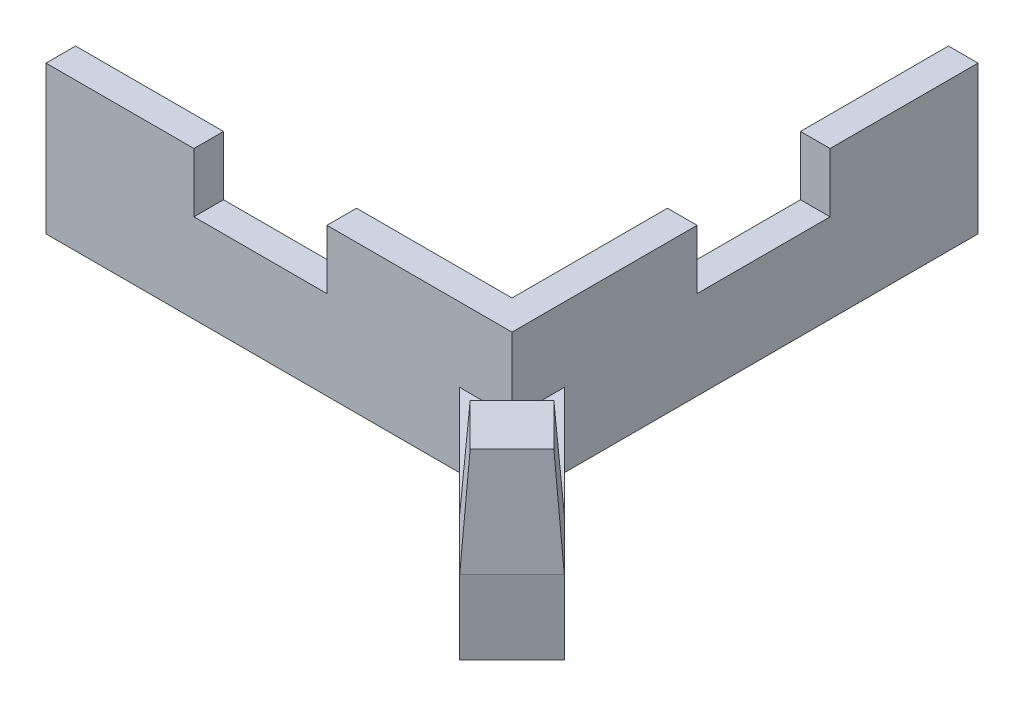
ISO-10303-21;
HEADER;
FILE_DESCRIPTION(('STEP AP214'),'2;1');
FILE_NAME('part.step','',(''),(''),'','','');
FILE_SCHEMA(('AUTOMOTIVE_DESIGN { 1 0 10303 214 1 1 1 1 }'));
ENDSEC;
DATA;
#1=APPLICATION_CONTEXT('core data for automotive mechanical design processes');
#2=APPLICATION_PROTOCOL_DEFINITION('international standard','automotive_design',2000,#1);
#3=PRODUCT_CONTEXT('',#1,'mechanical');
#4=PRODUCT('Part','Part','',(#3));
#5=PRODUCT_RELATED_PRODUCT_CATEGORY('part','',(#4));
#6=PRODUCT_DEFINITION_FORMATION('','',#4);
#7=PRODUCT_DEFINITION_CONTEXT('part definition',#1,'design');
#8=PRODUCT_DEFINITION('design','',#6,#7);
#9=PRODUCT_DEFINITION_SHAPE('','',#8);
#10=(LENGTH_UNIT() NAMED_UNIT(*) SI_UNIT(.MILLI.,.METRE.));
#11=(NAMED_UNIT(*) PLANE_ANGLE_UNIT() SI_UNIT($,.RADIAN.));
#12=(NAMED_UNIT(*) SI_UNIT($,.STERADIAN.) SOLID_ANGLE_UNIT());
#13=UNCERTAINTY_MEASURE_WITH_UNIT(LENGTH_MEASURE(1.E-05),#10,'distance_accuracy_value','');
#14=(GEOMETRIC_REPRESENTATION_CONTEXT(3) GLOBAL_UNCERTAINTY_ASSIGNED_CONTEXT((#13)) GLOBAL_UNIT_ASSIGNED_CONTEXT((#10,
#11,#12)) REPRESENTATION_CONTEXT('',''));
#15=CARTESIAN_POINT('',(0.,0.,0.));
#16=DIRECTION('',(0.,0.,1.));
#17=DIRECTION('',(1.,0.,0.));
#18=AXIS2_PLACEMENT_3D('',#15,#16,#17);
#19=CARTESIAN_POINT('',(-499993.035533906,-15.,-500000.));
#20=DIRECTION('',(0.,1.,0.));
#21=DIRECTION('',(0.,0.,1.));
#22=AXIS2_PLACEMENT_3D('',#19,#20,#21);
#23=PLANE('',#22);
#24=DIRECTION('',(0.707106781186548,0.,0.707106781186548));
#25=VECTOR('',#24,1.);
#26=CARTESIAN_POINT('',(-499993.035533906,-15.,-500000.));
#27=LINE('',#26,#25);
#28=CARTESIAN_POINT('',(8.96446609408486,-15.,2.));
#29=VERTEX_POINT('',#28);
#30=CARTESIAN_POINT('',(16.3890872965288,-15.,9.42462120245594));
#31=VERTEX_POINT('',#30);
#32=EDGE_CURVE('E279',#29,#31,#27,.T.);
#33=ORIENTED_EDGE('',*,*,#32,.T.);
#34=DIRECTION('',(0.707106781186548,0.,-0.707106781186548));
#35=VECTOR('',#34,1.);
#36=CARTESIAN_POINT('',(12.9068542494924,-15.,12.9068542494924));
#37=LINE('',#36,#35);
#38=CARTESIAN_POINT('',(19.9246212025628,-15.,5.88908729662307));
#39=VERTEX_POINT('',#38);
#40=EDGE_CURVE('E289',#31,#39,#37,.T.);
#41=ORIENTED_EDGE('',*,*,#40,.T.);
#42=DIRECTION('',(0.707106781186548,0.,0.707106781186548));
#43=VECTOR('',#42,1.);
#44=CARTESIAN_POINT('',(-499989.5,-15.,-500003.535533906));
#45=LINE('',#44,#43);
#46=CARTESIAN_POINT('',(12.5,-15.,-1.53553390595107));
#47=VERTEX_POINT('',#46);
#48=EDGE_CURVE('E270',#47,#39,#45,.T.);
#49=ORIENTED_EDGE('',*,*,#48,.F.);
#50=DIRECTION('',(0.,0.,-1.));
#51=VECTOR('',#50,1.);
#52=CARTESIAN_POINT('',(12.4999999999886,-15.0000000001227,-500000.));
#53=LINE('',#52,#51);
#54=CARTESIAN_POINT('',(12.4999999999886,-15.,2.00000000000955));
#55=VERTEX_POINT('',#54);
#56=EDGE_CURVE('E288',#55,#47,#53,.T.);
#57=ORIENTED_EDGE('',*,*,#56,.F.);
#58=DIRECTION('',(1.,0.,0.));
#59=VECTOR('',#58,1.);
#60=CARTESIAN_POINT('',(-499993.035533906,-14.9999999998773,2.00000000000955));
#61=LINE('',#60,#59);
#62=EDGE_CURVE('E330',#29,#55,#61,.T.);
#63=ORIENTED_EDGE('',*,*,#62,.F.);
#64=EDGE_LOOP('',(#33,#41,#49,#57,#63));
#65=FACE_BOUND('',#64,.T.);
#66=ADVANCED_FACE('F45',(#65),#23,.T.);
#67=CARTESIAN_POINT('',(0.,-10.,2.));
#68=DIRECTION('',(0.,1.,0.));
#69=DIRECTION('',(0.,0.,1.));
#70=AXIS2_PLACEMENT_3D('',#67,#68,#69);
#71=PLANE('',#70);
#72=DIRECTION('',(0.,0.,1.));
#73=VECTOR('',#72,1.);
#74=CARTESIAN_POINT('',(-9.,-10.,2.));
#75=LINE('',#74,#73);
#76=CARTESIAN_POINT('',(-9.,-10.,0.));
#77=VERTEX_POINT('',#76);
#78=CARTESIAN_POINT('',(-9.,-10.,2.));
#79=VERTEX_POINT('',#78);
#80=EDGE_CURVE('E355',#77,#79,#75,.T.);
#81=ORIENTED_EDGE('',*,*,#80,.F.);
#82=DIRECTION('',(1.,0.,0.));
#83=VECTOR('',#82,1.);
#84=CARTESIAN_POINT('',(0.,-10.,0.));
#85=LINE('',#84,#83);
#86=CARTESIAN_POINT('',(-19.,-10.,0.));
#87=VERTEX_POINT('',#86);
#88=EDGE_CURVE('E432',#87,#77,#85,.T.);
#89=ORIENTED_EDGE('',*,*,#88,.F.);
#90=DIRECTION('',(0.,0.,-1.));
#91=VECTOR('',#90,1.);
#92=CARTESIAN_POINT('',(-19.,-10.,2.));
#93=LINE('',#92,#91);
#94=CARTESIAN_POINT('',(-19.,-10.,2.));
#95=VERTEX_POINT('',#94);
#96=EDGE_CURVE('E366',#95,#87,#93,.T.);
#97=ORIENTED_EDGE('',*,*,#96,.F.);
#98=DIRECTION('',(1.,0.,0.));
#99=VECTOR('',#98,1.);
#100=CARTESIAN_POINT('',(0.,-10.,2.));
#101=LINE('',#100,#99);
#102=EDGE_CURVE('E526',#95,#79,#101,.T.);
#103=ORIENTED_EDGE('',*,*,#102,.T.);
#104=EDGE_LOOP('',(#81,#89,#97,#103));
#105=FACE_BOUND('',#104,.T.);
#106=ADVANCED_FACE('F499',(#105),#71,.T.);
#107=DIRECTION('',(0.,0.,1.));
#108=VECTOR('',#107,1.);
#109=CARTESIAN_POINT('',(10.5,-10.,-20.6980390271856));
#110=LINE('',#109,#108);
#111=CARTESIAN_POINT('',(10.5,-10.,-29.5));
#112=VERTEX_POINT('',#111);
#113=CARTESIAN_POINT('',(10.5,-10.,-19.5));
#114=VERTEX_POINT('',#113);
#115=EDGE_CURVE('E417',#112,#114,#110,.T.);
#116=ORIENTED_EDGE('',*,*,#115,.T.);
#117=DIRECTION('',(1.,0.,0.));
#118=VECTOR('',#117,1.);
#119=CARTESIAN_POINT('',(0.,-10.,-19.5));
#120=LINE('',#119,#118);
#121=CARTESIAN_POINT('',(12.5,-10.,-19.5));
#122=VERTEX_POINT('',#121);
#123=EDGE_CURVE('E383',#114,#122,#120,.T.);
#124=ORIENTED_EDGE('',*,*,#123,.T.);
#125=DIRECTION('',(0.,0.,1.));
#126=VECTOR('',#125,1.);
#127=CARTESIAN_POINT('',(12.5,-10.,0.));
#128=LINE('',#127,#126);
#129=CARTESIAN_POINT('',(12.5,-10.,-29.5));
#130=VERTEX_POINT('',#129);
#131=EDGE_CURVE('E529',#130,#122,#128,.T.);
#132=ORIENTED_EDGE('',*,*,#131,.F.);
#133=DIRECTION('',(1.,0.,0.));
#134=VECTOR('',#133,1.);
#135=CARTESIAN_POINT('',(10.5,-10.,-29.5));
#136=LINE('',#135,#134);
#137=EDGE_CURVE('E390',#112,#130,#136,.T.);
#138=ORIENTED_EDGE('',*,*,#137,.F.);
#139=EDGE_LOOP('',(#116,#124,#132,#138));
#140=FACE_BOUND('',#139,.T.);
#141=ADVANCED_FACE('F449',(#140),#71,.T.);
#142=CARTESIAN_POINT('',(0.,0.,0.));
#143=DIRECTION('',(0.,0.,1.));
#144=DIRECTION('',(1.,0.,0.));
#145=AXIS2_PLACEMENT_3D('',#142,#143,#144);
#146=PLANE('',#145);
#147=ORIENTED_EDGE('',*,*,#88,.T.);
#148=DIRECTION('',(0.,-1.,0.));
#149=VECTOR('',#148,1.);
#150=CARTESIAN_POINT('',(-9.,0.,0.));
#151=LINE('',#150,#149);
#152=CARTESIAN_POINT('',(-9.,-14.,0.));
#153=VERTEX_POINT('',#152);
#154=EDGE_CURVE('E357',#77,#153,#151,.T.);
#155=ORIENTED_EDGE('',*,*,#154,.T.);
#156=DIRECTION('',(1.,0.,0.));
#157=VECTOR('',#156,1.);
#158=CARTESIAN_POINT('',(0.,-14.,0.));
#159=LINE('',#158,#157);
#160=CARTESIAN_POINT('',(-0.0100000000000013,-14.,0.));
#161=VERTEX_POINT('',#160);
#162=EDGE_CURVE('E346',#153,#161,#159,.T.);
#163=ORIENTED_EDGE('',*,*,#162,.T.);
#164=DIRECTION('',(0.,1.,0.));
#165=VECTOR('',#164,1.);
#166=CARTESIAN_POINT('',(-0.0100000000000013,0.,0.));
#167=LINE('',#166,#165);
#168=CARTESIAN_POINT('',(-0.0100000000000013,-10.,0.));
#169=VERTEX_POINT('',#168);
#170=EDGE_CURVE('E352',#161,#169,#167,.T.);
#171=ORIENTED_EDGE('',*,*,#170,.T.);
#172=CARTESIAN_POINT('',(10.5,-10.,0.));
#173=VERTEX_POINT('',#172);
#174=EDGE_CURVE('E430',#169,#173,#85,.T.);
#175=ORIENTED_EDGE('',*,*,#174,.T.);
#176=DIRECTION('',(0.,1.,0.));
#177=VECTOR('',#176,1.);
#178=CARTESIAN_POINT('',(10.5,-10.,0.));
#179=LINE('',#178,#177);
#180=CARTESIAN_POINT('',(10.5,-20.,0.));
#181=VERTEX_POINT('',#180);
#182=EDGE_CURVE('E402',#181,#173,#179,.T.);
#183=ORIENTED_EDGE('',*,*,#182,.F.);
#184=DIRECTION('',(1.,0.,0.));
#185=VECTOR('',#184,1.);
#186=CARTESIAN_POINT('',(0.,-20.,0.));
#187=LINE('',#186,#185);
#188=CARTESIAN_POINT('',(-19.,-20.,0.));
#189=VERTEX_POINT('',#188);
#190=EDGE_CURVE('E443',#189,#181,#187,.T.);
#191=ORIENTED_EDGE('',*,*,#190,.F.);
#192=DIRECTION('',(0.,-1.,0.));
#193=VECTOR('',#192,1.);
#194=CARTESIAN_POINT('',(-19.,-10.,0.));
#195=LINE('',#194,#193);
#196=EDGE_CURVE('E369',#87,#189,#195,.T.);
#197=ORIENTED_EDGE('',*,*,#196,.F.);
#198=EDGE_LOOP('',(#147,#155,#163,#171,#175,#183,#191,#197));
#199=FACE_BOUND('',#198,.T.);
#200=ADVANCED_FACE('F465',(#199),#146,.F.);
#201=DIRECTION('',(0.,0.,-1.));
#202=VECTOR('',#201,1.);
#203=CARTESIAN_POINT('',(-0.0100000000000013,-10.,2.));
#204=LINE('',#203,#202);
#205=CARTESIAN_POINT('',(-0.0100000000000013,-10.,2.));
#206=VERTEX_POINT('',#205);
#207=EDGE_CURVE('E350',#206,#169,#204,.T.);
#208=ORIENTED_EDGE('',*,*,#207,.F.);
#209=CARTESIAN_POINT('',(12.5,-10.,2.));
#210=VERTEX_POINT('',#209);
#211=EDGE_CURVE('E445',#206,#210,#101,.T.);
#212=ORIENTED_EDGE('',*,*,#211,.T.);
#213=CARTESIAN_POINT('',(12.5,-10.,-10.51));
#214=VERTEX_POINT('',#213);
#215=EDGE_CURVE('E473',#214,#210,#128,.T.);
#216=ORIENTED_EDGE('',*,*,#215,.F.);
#217=DIRECTION('',(1.,0.,0.));
#218=VECTOR('',#217,1.);
#219=CARTESIAN_POINT('',(0.,-10.,-10.51));
#220=LINE('',#219,#218);
#221=CARTESIAN_POINT('',(10.5,-10.,-10.51));
#222=VERTEX_POINT('',#221);
#223=EDGE_CURVE('E388',#222,#214,#220,.T.);
#224=ORIENTED_EDGE('',*,*,#223,.F.);
#225=EDGE_CURVE('E411',#222,#173,#110,.T.);
#226=ORIENTED_EDGE('',*,*,#225,.T.);
#227=ORIENTED_EDGE('',*,*,#174,.F.);
#228=EDGE_LOOP('',(#208,#212,#216,#224,#226,#227));
#229=FACE_BOUND('',#228,.T.);
#230=ADVANCED_FACE('F47',(#229),#71,.T.);
#231=CARTESIAN_POINT('',(0.,-20.,2.));
#232=DIRECTION('',(0.,1.,0.));
#233=DIRECTION('',(-1.,0.,0.));
#234=AXIS2_PLACEMENT_3D('',#231,#232,#233);
#235=PLANE('',#234);
#236=ORIENTED_EDGE('',*,*,#190,.T.);
#237=DIRECTION('',(0.,0.,1.));
#238=VECTOR('',#237,1.);
#239=CARTESIAN_POINT('',(10.5,-20.,-20.6980390271856));
#240=LINE('',#239,#238);
#241=CARTESIAN_POINT('',(10.5,-20.,-29.5));
#242=VERTEX_POINT('',#241);
#243=EDGE_CURVE('E414',#242,#181,#240,.T.);
#244=ORIENTED_EDGE('',*,*,#243,.F.);
#245=DIRECTION('',(-1.,0.,0.));
#246=VECTOR('',#245,1.);
#247=CARTESIAN_POINT('',(12.5,-20.,-29.5));
#248=LINE('',#247,#246);
#249=CARTESIAN_POINT('',(12.5,-20.,-29.5));
#250=VERTEX_POINT('',#249);
#251=EDGE_CURVE('E396',#250,#242,#248,.T.);
#252=ORIENTED_EDGE('',*,*,#251,.F.);
#253=DIRECTION('',(0.,0.,-1.));
#254=VECTOR('',#253,1.);
#255=CARTESIAN_POINT('',(12.5,-20.,2.));
#256=LINE('',#255,#254);
#257=CARTESIAN_POINT('',(12.5,-20.,-1.53553390599414));
#258=VERTEX_POINT('',#257);
#259=EDGE_CURVE('E405',#258,#250,#256,.T.);
#260=ORIENTED_EDGE('',*,*,#259,.F.);
#261=DIRECTION('',(0.707106781186548,0.,0.707106781186548));
#262=VECTOR('',#261,1.);
#263=CARTESIAN_POINT('',(-499989.5,-20.,-500003.535533906));
#264=LINE('',#263,#262);
#265=CARTESIAN_POINT('',(23.4601551083915,-20.,9.42462120245875));
#266=VERTEX_POINT('',#265);
#267=EDGE_CURVE('E267',#258,#266,#264,.T.);
#268=ORIENTED_EDGE('',*,*,#267,.T.);
#269=DIRECTION('',(0.707106781186547,0.,-0.707106781186548));
#270=VECTOR('',#269,1.);
#271=CARTESIAN_POINT('',(19.9246212024588,-20.,12.9601551083915));
#272=LINE('',#271,#270);
#273=CARTESIAN_POINT('',(19.9246212024588,-20.,12.9601551083915));
#274=VERTEX_POINT('',#273);
#275=EDGE_CURVE('E255',#274,#266,#272,.T.);
#276=ORIENTED_EDGE('',*,*,#275,.F.);
#277=DIRECTION('',(0.707106781186548,0.,0.707106781186548));
#278=VECTOR('',#277,1.);
#279=CARTESIAN_POINT('',(-499993.035533906,-20.,-500000.));
#280=LINE('',#279,#278);
#281=CARTESIAN_POINT('',(8.96446609408867,-20.,2.));
#282=VERTEX_POINT('',#281);
#283=EDGE_CURVE('E265',#282,#274,#280,.T.);
#284=ORIENTED_EDGE('',*,*,#283,.F.);
#285=DIRECTION('',(1.,0.,0.));
#286=VECTOR('',#285,1.);
#287=CARTESIAN_POINT('',(0.,-20.,2.));
#288=LINE('',#287,#286);
#289=CARTESIAN_POINT('',(-19.,-20.,2.));
#290=VERTEX_POINT('',#289);
#291=EDGE_CURVE('E426',#290,#282,#288,.T.);
#292=ORIENTED_EDGE('',*,*,#291,.F.);
#293=DIRECTION('',(0.,0.,1.));
#294=VECTOR('',#293,1.);
#295=CARTESIAN_POINT('',(-19.,-20.,0.));
#296=LINE('',#295,#294);
#297=EDGE_CURVE('E360',#189,#290,#296,.T.);
#298=ORIENTED_EDGE('',*,*,#297,.F.);
#299=EDGE_LOOP('',(#236,#244,#252,#260,#268,#276,#284,#292,#298));
#300=FACE_BOUND('',#299,.T.);
#301=ADVANCED_FACE('F462',(#300),#235,.F.);
#302=CARTESIAN_POINT('',(0.,0.,2.));
#303=DIRECTION('',(0.,0.,1.));
#304=DIRECTION('',(1.,0.,0.));
#305=AXIS2_PLACEMENT_3D('',#302,#303,#304);
#306=PLANE('',#305);
#307=DIRECTION('',(0.,1.,0.));
#308=VECTOR('',#307,1.);
#309=CARTESIAN_POINT('',(8.96446609408486,-14.9999999997398,2.00000000000955));
#310=LINE('',#309,#308);
#311=EDGE_CURVE('E268',#282,#29,#310,.T.);
#312=ORIENTED_EDGE('',*,*,#311,.T.);
#313=ORIENTED_EDGE('',*,*,#62,.T.);
#314=DIRECTION('',(0.,-1.,0.));
#315=VECTOR('',#314,1.);
#316=CARTESIAN_POINT('',(12.5,-10.,2.));
#317=LINE('',#316,#315);
#318=EDGE_CURVE('E433',#210,#55,#317,.T.);
#319=ORIENTED_EDGE('',*,*,#318,.F.);
#320=ORIENTED_EDGE('',*,*,#211,.F.);
#321=DIRECTION('',(0.,1.,0.));
#322=VECTOR('',#321,1.);
#323=CARTESIAN_POINT('',(-0.0100000000000013,-9.00000000000001,2.));
#324=LINE('',#323,#322);
#325=CARTESIAN_POINT('',(-0.0100000000000013,-14.,2.));
#326=VERTEX_POINT('',#325);
#327=EDGE_CURVE('E333',#326,#206,#324,.T.);
#328=ORIENTED_EDGE('',*,*,#327,.F.);
#329=DIRECTION('',(1.,0.,0.));
#330=VECTOR('',#329,1.);
#331=CARTESIAN_POINT('',(-9.,-14.,2.));
#332=LINE('',#331,#330);
#333=CARTESIAN_POINT('',(-9.,-14.,2.));
#334=VERTEX_POINT('',#333);
#335=EDGE_CURVE('E331',#334,#326,#332,.T.);
#336=ORIENTED_EDGE('',*,*,#335,.F.);
#337=DIRECTION('',(0.,-1.,0.));
#338=VECTOR('',#337,1.);
#339=CARTESIAN_POINT('',(-9.,0.,2.));
#340=LINE('',#339,#338);
#341=EDGE_CURVE('E12',#79,#334,#340,.T.);
#342=ORIENTED_EDGE('',*,*,#341,.F.);
#343=ORIENTED_EDGE('',*,*,#102,.F.);
#344=DIRECTION('',(0.,1.,0.));
#345=VECTOR('',#344,1.);
#346=CARTESIAN_POINT('',(-19.,-20.,2.));
#347=LINE('',#346,#345);
#348=EDGE_CURVE('E363',#290,#95,#347,.T.);
#349=ORIENTED_EDGE('',*,*,#348,.F.);
#350=ORIENTED_EDGE('',*,*,#291,.T.);
#351=EDGE_LOOP('',(#312,#313,#319,#320,#328,#336,#342,#343,#349,#350));
#352=FACE_BOUND('',#351,.T.);
#353=ADVANCED_FACE('F524',(#352),#306,.T.);
#354=CARTESIAN_POINT('',(12.5,0.,0.));
#355=DIRECTION('',(1.,0.,0.));
#356=DIRECTION('',(0.,0.,-1.));
#357=AXIS2_PLACEMENT_3D('',#354,#355,#356);
#358=PLANE('',#357);
#359=DIRECTION('',(0.,-1.,0.));
#360=VECTOR('',#359,1.);
#361=CARTESIAN_POINT('',(12.4999999999886,-15.,-1.53553390595107));
#362=LINE('',#361,#360);
#363=EDGE_CURVE('E325',#47,#258,#362,.T.);
#364=ORIENTED_EDGE('',*,*,#363,.T.);
#365=ORIENTED_EDGE('',*,*,#259,.T.);
#366=DIRECTION('',(0.,-1.,0.));
#367=VECTOR('',#366,1.);
#368=CARTESIAN_POINT('',(12.5,-10.,-29.5));
#369=LINE('',#368,#367);
#370=EDGE_CURVE('E393',#130,#250,#369,.T.);
#371=ORIENTED_EDGE('',*,*,#370,.F.);
#372=ORIENTED_EDGE('',*,*,#131,.T.);
#373=DIRECTION('',(0.,-1.,0.));
#374=VECTOR('',#373,1.);
#375=CARTESIAN_POINT('',(12.5,-9.,-19.5));
#376=LINE('',#375,#374);
#377=CARTESIAN_POINT('',(12.5,-14.,-19.5));
#378=VERTEX_POINT('',#377);
#379=EDGE_CURVE('E377',#122,#378,#376,.T.);
#380=ORIENTED_EDGE('',*,*,#379,.T.);
#381=DIRECTION('',(0.,0.,-1.));
#382=VECTOR('',#381,1.);
#383=CARTESIAN_POINT('',(12.5,-14.,-10.51));
#384=LINE('',#383,#382);
#385=CARTESIAN_POINT('',(12.5,-14.,-10.51));
#386=VERTEX_POINT('',#385);
#387=EDGE_CURVE('E374',#386,#378,#384,.T.);
#388=ORIENTED_EDGE('',*,*,#387,.F.);
#389=DIRECTION('',(0.,-1.,0.));
#390=VECTOR('',#389,1.);
#391=CARTESIAN_POINT('',(12.5,-9.,-10.51));
#392=LINE('',#391,#390);
#393=EDGE_CURVE('E372',#214,#386,#392,.T.);
#394=ORIENTED_EDGE('',*,*,#393,.F.);
#395=ORIENTED_EDGE('',*,*,#215,.T.);
#396=ORIENTED_EDGE('',*,*,#318,.T.);
#397=ORIENTED_EDGE('',*,*,#56,.T.);
#398=EDGE_LOOP('',(#364,#365,#371,#372,#380,#388,#394,#395,#396,#397));
#399=FACE_BOUND('',#398,.T.);
#400=ADVANCED_FACE('F480',(#399),#358,.T.);
#401=CARTESIAN_POINT('',(10.5,-10.,-20.6980390271856));
#402=DIRECTION('',(1.,0.,0.));
#403=DIRECTION('',(0.,1.,0.));
#404=AXIS2_PLACEMENT_3D('',#401,#402,#403);
#405=PLANE('',#404);
#406=ORIENTED_EDGE('',*,*,#225,.F.);
#407=DIRECTION('',(0.,-1.,0.));
#408=VECTOR('',#407,1.);
#409=CARTESIAN_POINT('',(10.5,-10.,-10.51));
#410=LINE('',#409,#408);
#411=CARTESIAN_POINT('',(10.5,-14.,-10.51));
#412=VERTEX_POINT('',#411);
#413=EDGE_CURVE('E55',#222,#412,#410,.T.);
#414=ORIENTED_EDGE('',*,*,#413,.T.);
#415=DIRECTION('',(0.,0.,-1.));
#416=VECTOR('',#415,1.);
#417=CARTESIAN_POINT('',(10.5,-14.,-20.6980390271856));
#418=LINE('',#417,#416);
#419=CARTESIAN_POINT('',(10.5,-14.,-19.5));
#420=VERTEX_POINT('',#419);
#421=EDGE_CURVE('E422',#412,#420,#418,.T.);
#422=ORIENTED_EDGE('',*,*,#421,.T.);
#423=DIRECTION('',(0.,-1.,0.));
#424=VECTOR('',#423,1.);
#425=CARTESIAN_POINT('',(10.5,-10.,-19.5));
#426=LINE('',#425,#424);
#427=EDGE_CURVE('E425',#114,#420,#426,.T.);
#428=ORIENTED_EDGE('',*,*,#427,.F.);
#429=ORIENTED_EDGE('',*,*,#115,.F.);
#430=DIRECTION('',(0.,1.,0.));
#431=VECTOR('',#430,1.);
#432=CARTESIAN_POINT('',(10.5,-20.,-29.5));
#433=LINE('',#432,#431);
#434=EDGE_CURVE('E399',#242,#112,#433,.T.);
#435=ORIENTED_EDGE('',*,*,#434,.F.);
#436=ORIENTED_EDGE('',*,*,#243,.T.);
#437=ORIENTED_EDGE('',*,*,#182,.T.);
#438=EDGE_LOOP('',(#406,#414,#422,#428,#429,#435,#436,#437));
#439=FACE_BOUND('',#438,.T.);
#440=ADVANCED_FACE('F455',(#439),#405,.F.);
#441=CARTESIAN_POINT('',(0.,0.,-29.5));
#442=DIRECTION('',(0.,0.,-1.));
#443=DIRECTION('',(-1.,0.,0.));
#444=AXIS2_PLACEMENT_3D('',#441,#442,#443);
#445=PLANE('',#444);
#446=ORIENTED_EDGE('',*,*,#137,.T.);
#447=ORIENTED_EDGE('',*,*,#370,.T.);
#448=ORIENTED_EDGE('',*,*,#251,.T.);
#449=ORIENTED_EDGE('',*,*,#434,.T.);
#450=EDGE_LOOP('',(#446,#447,#448,#449));
#451=FACE_BOUND('',#450,.T.);
#452=ADVANCED_FACE('F457',(#451),#445,.T.);
#453=CARTESIAN_POINT('',(-6.5,-14.,-10.51));
#454=DIRECTION('',(0.,-1.,0.));
#455=DIRECTION('',(0.,0.,-1.));
#456=AXIS2_PLACEMENT_3D('',#453,#454,#455);
#457=PLANE('',#456);
#458=DIRECTION('',(1.,0.,0.));
#459=VECTOR('',#458,1.);
#460=CARTESIAN_POINT('',(-6.5,-14.,-10.51));
#461=LINE('',#460,#459);
#462=EDGE_CURVE('E380',#412,#386,#461,.T.);
#463=ORIENTED_EDGE('',*,*,#462,.T.);
#464=ORIENTED_EDGE('',*,*,#387,.T.);
#465=DIRECTION('',(1.,0.,0.));
#466=VECTOR('',#465,1.);
#467=CARTESIAN_POINT('',(-6.5,-14.,-19.5));
#468=LINE('',#467,#466);
#469=EDGE_CURVE('E381',#420,#378,#468,.T.);
#470=ORIENTED_EDGE('',*,*,#469,.F.);
#471=ORIENTED_EDGE('',*,*,#421,.F.);
#472=EDGE_LOOP('',(#463,#464,#470,#471));
#473=FACE_BOUND('',#472,.T.);
#474=ADVANCED_FACE('F483',(#473),#457,.F.);
#475=CARTESIAN_POINT('',(-6.5,-9.,-10.51));
#476=DIRECTION('',(0.,0.,1.));
#477=DIRECTION('',(1.,0.,0.));
#478=AXIS2_PLACEMENT_3D('',#475,#476,#477);
#479=PLANE('',#478);
#480=ORIENTED_EDGE('',*,*,#223,.T.);
#481=ORIENTED_EDGE('',*,*,#393,.T.);
#482=ORIENTED_EDGE('',*,*,#462,.F.);
#483=ORIENTED_EDGE('',*,*,#413,.F.);
#484=EDGE_LOOP('',(#480,#481,#482,#483));
#485=FACE_BOUND('',#484,.T.);
#486=ADVANCED_FACE('F476',(#485),#479,.F.);
#487=CARTESIAN_POINT('',(-6.5,-9.,-19.5));
#488=DIRECTION('',(0.,0.,1.));
#489=DIRECTION('',(1.,0.,0.));
#490=AXIS2_PLACEMENT_3D('',#487,#488,#489);
#491=PLANE('',#490);
#492=ORIENTED_EDGE('',*,*,#427,.T.);
#493=ORIENTED_EDGE('',*,*,#469,.T.);
#494=ORIENTED_EDGE('',*,*,#379,.F.);
#495=ORIENTED_EDGE('',*,*,#123,.F.);
#496=EDGE_LOOP('',(#492,#493,#494,#495));
#497=FACE_BOUND('',#496,.T.);
#498=ADVANCED_FACE('F485',(#497),#491,.T.);
#499=CARTESIAN_POINT('',(-19.,0.,0.));
#500=DIRECTION('',(-1.,0.,0.));
#501=DIRECTION('',(0.,-1.,0.));
#502=AXIS2_PLACEMENT_3D('',#499,#500,#501);
#503=PLANE('',#502);
#504=ORIENTED_EDGE('',*,*,#297,.T.);
#505=ORIENTED_EDGE('',*,*,#348,.T.);
#506=ORIENTED_EDGE('',*,*,#96,.T.);
#507=ORIENTED_EDGE('',*,*,#196,.T.);
#508=EDGE_LOOP('',(#504,#505,#506,#507));
#509=FACE_BOUND('',#508,.T.);
#510=ADVANCED_FACE('F487',(#509),#503,.T.);
#511=CARTESIAN_POINT('',(-9.,-9.00000000000001,-17.));
#512=DIRECTION('',(-1.,0.,0.));
#513=DIRECTION('',(0.,0.,1.));
#514=AXIS2_PLACEMENT_3D('',#511,#512,#513);
#515=PLANE('',#514);
#516=ORIENTED_EDGE('',*,*,#80,.T.);
#517=ORIENTED_EDGE('',*,*,#341,.T.);
#518=DIRECTION('',(0.,0.,1.));
#519=VECTOR('',#518,1.);
#520=CARTESIAN_POINT('',(-9.,-14.,-17.));
#521=LINE('',#520,#519);
#522=EDGE_CURVE('E339',#153,#334,#521,.T.);
#523=ORIENTED_EDGE('',*,*,#522,.F.);
#524=ORIENTED_EDGE('',*,*,#154,.F.);
#525=EDGE_LOOP('',(#516,#517,#523,#524));
#526=FACE_BOUND('',#525,.T.);
#527=ADVANCED_FACE('F493',(#526),#515,.F.);
#528=CARTESIAN_POINT('',(-0.0100000000000013,-9.00000000000001,-17.));
#529=DIRECTION('',(1.,0.,0.));
#530=DIRECTION('',(0.,0.,-1.));
#531=AXIS2_PLACEMENT_3D('',#528,#529,#530);
#532=PLANE('',#531);
#533=DIRECTION('',(0.,0.,1.));
#534=VECTOR('',#533,1.);
#535=CARTESIAN_POINT('',(-0.0100000000000013,-14.,-17.));
#536=LINE('',#535,#534);
#537=EDGE_CURVE('E344',#161,#326,#536,.T.);
#538=ORIENTED_EDGE('',*,*,#537,.T.);
#539=ORIENTED_EDGE('',*,*,#327,.T.);
#540=ORIENTED_EDGE('',*,*,#207,.T.);
#541=ORIENTED_EDGE('',*,*,#170,.F.);
#542=EDGE_LOOP('',(#538,#539,#540,#541));
#543=FACE_BOUND('',#542,.T.);
#544=ADVANCED_FACE('F508',(#543),#532,.F.);
#545=CARTESIAN_POINT('',(-9.,-14.,-17.));
#546=DIRECTION('',(0.,-1.,0.));
#547=DIRECTION('',(0.,0.,-1.));
#548=AXIS2_PLACEMENT_3D('',#545,#546,#547);
#549=PLANE('',#548);
#550=ORIENTED_EDGE('',*,*,#522,.T.);
#551=ORIENTED_EDGE('',*,*,#335,.T.);
#552=ORIENTED_EDGE('',*,*,#537,.F.);
#553=ORIENTED_EDGE('',*,*,#162,.F.);
#554=EDGE_LOOP('',(#550,#551,#552,#553));
#555=FACE_BOUND('',#554,.T.);
#556=ADVANCED_FACE('F511',(#555),#549,.F.);
#557=CARTESIAN_POINT('',(-499989.5,-15.,-500003.535533906));
#558=DIRECTION('',(0.707106781186548,0.,-0.707106781186548));
#559=DIRECTION('',(-0.707106781186548,0.,-0.707106781186548));
#560=AXIS2_PLACEMENT_3D('',#557,#558,#559);
#561=PLANE('',#560);
#562=ORIENTED_EDGE('',*,*,#363,.F.);
#563=ORIENTED_EDGE('',*,*,#48,.T.);
#564=DIRECTION('',(-0.707106781186548,0.,-0.707106781186548));
#565=VECTOR('',#564,1.);
#566=CARTESIAN_POINT('',(7.01776695300616,-15.,-7.01776695300616));
#567=LINE('',#566,#565);
#568=CARTESIAN_POINT('',(23.4601551084574,-14.9999999993471,9.424621202498));
#569=VERTEX_POINT('',#568);
#570=EDGE_CURVE('E63',#569,#39,#567,.T.);
#571=ORIENTED_EDGE('',*,*,#570,.F.);
#572=DIRECTION('',(0.,1.,0.));
#573=VECTOR('',#572,1.);
#574=CARTESIAN_POINT('',(23.4601551083915,-20.,9.42462120245875));
#575=LINE('',#574,#573);
#576=EDGE_CURVE('E263',#266,#569,#575,.T.);
#577=ORIENTED_EDGE('',*,*,#576,.F.);
#578=ORIENTED_EDGE('',*,*,#267,.F.);
#579=EDGE_LOOP('',(#562,#563,#571,#577,#578));
#580=FACE_BOUND('',#579,.T.);
#581=ADVANCED_FACE('F323',(#580),#561,.T.);
#582=CARTESIAN_POINT('',(-499993.035533906,-15.,-500000.));
#583=DIRECTION('',(-0.707106781186548,0.,0.707106781186548));
#584=DIRECTION('',(0.707106781186548,0.,0.707106781186548));
#585=AXIS2_PLACEMENT_3D('',#582,#583,#584);
#586=PLANE('',#585);
#587=ORIENTED_EDGE('',*,*,#311,.F.);
#588=ORIENTED_EDGE('',*,*,#283,.T.);
#589=DIRECTION('',(0.,-1.,0.));
#590=VECTOR('',#589,1.);
#591=CARTESIAN_POINT('',(19.9246212024588,-15.,12.9601551083915));
#592=LINE('',#591,#590);
#593=CARTESIAN_POINT('',(19.9246212024588,-15.,12.9601551083915));
#594=VERTEX_POINT('',#593);
#595=EDGE_CURVE('E264',#594,#274,#592,.T.);
#596=ORIENTED_EDGE('',*,*,#595,.F.);
#597=DIRECTION('',(0.707106781186548,0.,0.707106781186548));
#598=VECTOR('',#597,1.);
#599=CARTESIAN_POINT('',(3.48223304703644,-15.,-3.48223304703644));
#600=LINE('',#599,#598);
#601=EDGE_CURVE('E291',#31,#594,#600,.T.);
#602=ORIENTED_EDGE('',*,*,#601,.F.);
#603=ORIENTED_EDGE('',*,*,#32,.F.);
#604=EDGE_LOOP('',(#587,#588,#596,#602,#603));
#605=FACE_BOUND('',#604,.T.);
#606=ADVANCED_FACE('F315',(#605),#586,.T.);
#607=CARTESIAN_POINT('',(16.4423881554251,0.,16.4423881554251));
#608=DIRECTION('',(0.707106781186548,0.,0.707106781186547));
#609=DIRECTION('',(0.707106781186547,0.,-0.707106781186548));
#610=AXIS2_PLACEMENT_3D('',#607,#608,#609);
#611=PLANE('',#610);
#612=DIRECTION('',(0.707106781186547,0.,-0.707106781186548));
#613=VECTOR('',#612,1.);
#614=CARTESIAN_POINT('',(16.4423881554251,-15.,16.4423881554251));
#615=LINE('',#614,#613);
#616=EDGE_CURVE('E283',#569,#594,#615,.F.);
#617=ORIENTED_EDGE('',*,*,#616,.T.);
#618=ORIENTED_EDGE('',*,*,#595,.T.);
#619=ORIENTED_EDGE('',*,*,#275,.T.);
#620=ORIENTED_EDGE('',*,*,#576,.T.);
#621=EDGE_LOOP('',(#617,#618,#619,#620));
#622=FACE_BOUND('',#621,.T.);
#623=ADVANCED_FACE('F229',(#622),#611,.T.);
#624=CARTESIAN_POINT('',(0.,-8.,0.));
#625=DIRECTION('',(0.,1.,0.));
#626=DIRECTION('',(0.,0.,1.));
#627=AXIS2_PLACEMENT_3D('',#624,#625,#626);
#628=PLANE('',#627);
#629=DIRECTION('',(-0.707106781186548,0.,-0.707106781186547));
#630=VECTOR('',#629,1.);
#631=CARTESIAN_POINT('',(3.8357864376357,-8.,-3.8357864376357));
#632=LINE('',#631,#630);
#633=CARTESIAN_POINT('',(19.9246212024675,-8.,12.2530483271961));
#634=VERTEX_POINT('',#633);
#635=CARTESIAN_POINT('',(17.0961940777214,-8.,9.42462120244995));
#636=VERTEX_POINT('',#635);
#637=EDGE_CURVE('E250',#634,#636,#632,.T.);
#638=ORIENTED_EDGE('',*,*,#637,.F.);
#639=DIRECTION('',(0.707106781186547,0.,-0.707106781186548));
#640=VECTOR('',#639,1.);
#641=CARTESIAN_POINT('',(16.0888347648319,-8.,16.0888347648318));
#642=LINE('',#641,#640);
#643=CARTESIAN_POINT('',(22.7530483272137,-8.00000000000001,9.42462120244995));
#644=VERTEX_POINT('',#643);
#645=EDGE_CURVE('E210',#634,#644,#642,.T.);
#646=ORIENTED_EDGE('',*,*,#645,.T.);
#647=DIRECTION('',(-0.707106781186547,0.,-0.707106781186548));
#648=VECTOR('',#647,1.);
#649=CARTESIAN_POINT('',(6.6642135623819,-8.00000000000001,-6.6642135623819));
#650=LINE('',#649,#648);
#651=CARTESIAN_POINT('',(19.9246212024676,-8.00000000000001,6.59619407770376));
#652=VERTEX_POINT('',#651);
#653=EDGE_CURVE('E187',#644,#652,#650,.T.);
#654=ORIENTED_EDGE('',*,*,#653,.T.);
#655=DIRECTION('',(-0.707106781186548,0.,0.707106781186547));
#656=VECTOR('',#655,1.);
#657=CARTESIAN_POINT('',(13.2604076400856,-8.,13.2604076400857));
#658=LINE('',#657,#656);
#659=EDGE_CURVE('E196',#652,#636,#658,.T.);
#660=ORIENTED_EDGE('',*,*,#659,.T.);
#661=EDGE_LOOP('',(#638,#646,#654,#660));
#662=FACE_BOUND('',#661,.T.);
#663=ADVANCED_FACE('F209',(#662),#628,.T.);
#664=CARTESIAN_POINT('',(6.22837512043616,0.62916089768858,-6.22837512043616));
#665=DIRECTION('',(0.705309810603516,0.0712470499941236,-0.705309810603516));
#666=DIRECTION('',(-0.707106781186548,0.,-0.707106781186548));
#667=AXIS2_PLACEMENT_3D('',#664,#665,#666);
#668=PLANE('',#667);
#669=DIRECTION('',(0.100503781543244,-0.994936676324432,8.68887513369269E-12));
#670=VECTOR('',#669,1.);
#671=CARTESIAN_POINT('',(22.7530483272137,-8.00000000000001,9.42462120244995));
#672=LINE('',#671,#670);
#673=EDGE_CURVE('E193',#644,#569,#672,.T.);
#674=ORIENTED_EDGE('',*,*,#673,.T.);
#675=ORIENTED_EDGE('',*,*,#570,.T.);
#676=DIRECTION('',(4.4045989043272E-12,-0.994936676325742,-0.100503781530282));
#677=VECTOR('',#676,1.);
#678=CARTESIAN_POINT('',(19.9246212024676,-8.00000000000001,6.59619407770376));
#679=LINE('',#678,#677);
#680=EDGE_CURVE('E183',#652,#39,#679,.T.);
#681=ORIENTED_EDGE('',*,*,#680,.F.);
#682=ORIENTED_EDGE('',*,*,#653,.F.);
#683=EDGE_LOOP('',(#674,#675,#681,#682));
#684=FACE_BOUND('',#683,.T.);
#685=ADVANCED_FACE('F185',(#684),#668,.T.);
#686=CARTESIAN_POINT('',(13.595105872841,-1.37331307909071,13.595105872841));
#687=DIRECTION('',(0.70530981060383,-0.0712470499879098,0.70530981060383));
#688=DIRECTION('',(0.707106781186548,0.,-0.707106781186548));
#689=AXIS2_PLACEMENT_3D('',#686,#687,#688);
#690=PLANE('',#689);
#691=ORIENTED_EDGE('',*,*,#680,.T.);
#692=ORIENTED_EDGE('',*,*,#40,.F.);
#693=DIRECTION('',(-0.100503781526763,-0.994936676326097,8.50888424699877E-13));
#694=VECTOR('',#693,1.);
#695=CARTESIAN_POINT('',(17.0961940777214,-8.,9.42462120244995));
#696=LINE('',#695,#694);
#697=EDGE_CURVE('E200',#636,#31,#696,.T.);
#698=ORIENTED_EDGE('',*,*,#697,.F.);
#699=ORIENTED_EDGE('',*,*,#659,.F.);
#700=EDGE_LOOP('',(#691,#692,#698,#699));
#701=FACE_BOUND('',#700,.T.);
#702=ADVANCED_FACE('F198',(#701),#690,.F.);
#703=CARTESIAN_POINT('',(15.6051556061632,1.57635876436991,15.6051556061632));
#704=DIRECTION('',(0.70530981060383,0.0712470499879106,0.705309810603829));
#705=DIRECTION('',(0.707106781186547,0.,-0.707106781186548));
#706=AXIS2_PLACEMENT_3D('',#703,#704,#705);
#707=PLANE('',#706);
#708=DIRECTION('',(-1.249580566902E-12,-0.994936676326057,0.10050378152716));
#709=VECTOR('',#708,1.);
#710=CARTESIAN_POINT('',(19.9246212024675,-8.,12.2530483271961));
#711=LINE('',#710,#709);
#712=EDGE_CURVE('E192',#634,#594,#711,.T.);
#713=ORIENTED_EDGE('',*,*,#712,.T.);
#714=ORIENTED_EDGE('',*,*,#616,.F.);
#715=ORIENTED_EDGE('',*,*,#673,.F.);
#716=ORIENTED_EDGE('',*,*,#645,.F.);
#717=EDGE_LOOP('',(#713,#714,#715,#716));
#718=FACE_BOUND('',#717,.T.);
#719=ADVANCED_FACE('F311',(#718),#707,.T.);
#720=CARTESIAN_POINT('',(4.21832538716086,-0.426115212366188,-4.21832538716086));
#721=DIRECTION('',(-0.705309810603769,0.0712470499891098,0.705309810603769));
#722=DIRECTION('',(0.707106781186548,0.,0.707106781186548));
#723=AXIS2_PLACEMENT_3D('',#720,#721,#722);
#724=PLANE('',#723);
#725=ORIENTED_EDGE('',*,*,#697,.T.);
#726=ORIENTED_EDGE('',*,*,#601,.T.);
#727=ORIENTED_EDGE('',*,*,#712,.F.);
#728=ORIENTED_EDGE('',*,*,#637,.T.);
#729=EDGE_LOOP('',(#725,#726,#727,#728));
#730=FACE_BOUND('',#729,.T.);
#731=ADVANCED_FACE('F304',(#730),#724,.T.);
#732=CLOSED_SHELL('',(#66,#106,#141,#200,#230,#301,#353,#400,#440,#452,#474,#486,#498,#510,#527,
#544,#556,#581,#606,#623,#663,#685,#702,#719,#731));
#733=MANIFOLD_SOLID_BREP('B2',#732);
#734=ADVANCED_BREP_SHAPE_REPRESENTATION('',(#18,#733),#14);
#735=SHAPE_DEFINITION_REPRESENTATION(#9,#734);
ENDSEC;
END-ISO-10303-21;
